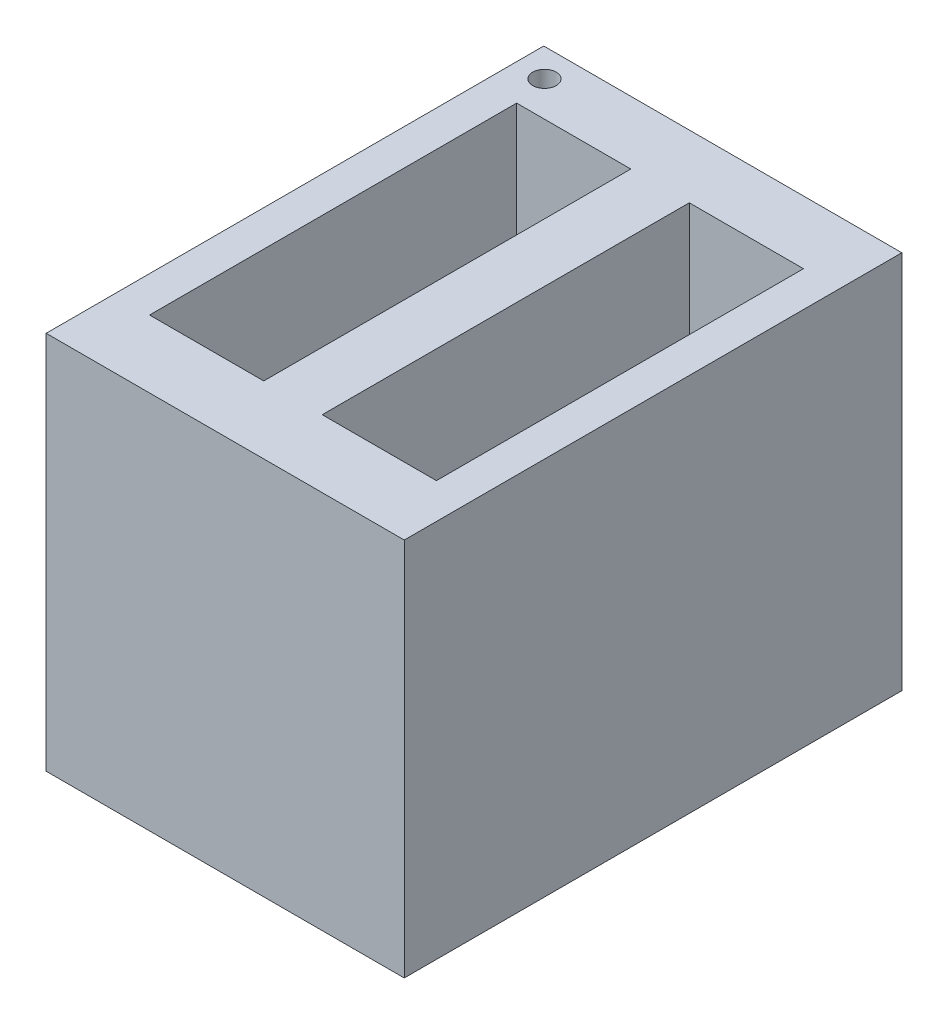
ISO-10303-21;
HEADER;
FILE_DESCRIPTION(('STEP AP214'),'2;1');
FILE_NAME('part.step','',(''),(''),'','','');
FILE_SCHEMA(('AUTOMOTIVE_DESIGN { 1 0 10303 214 1 1 1 1 }'));
ENDSEC;
DATA;
#1=APPLICATION_CONTEXT('core data for automotive mechanical design processes');
#2=APPLICATION_PROTOCOL_DEFINITION('international standard','automotive_design',2000,#1);
#3=PRODUCT_CONTEXT('',#1,'mechanical');
#4=PRODUCT('Part','Part','',(#3));
#5=PRODUCT_RELATED_PRODUCT_CATEGORY('part','',(#4));
#6=PRODUCT_DEFINITION_FORMATION('','',#4);
#7=PRODUCT_DEFINITION_CONTEXT('part definition',#1,'design');
#8=PRODUCT_DEFINITION('design','',#6,#7);
#9=PRODUCT_DEFINITION_SHAPE('','',#8);
#10=(LENGTH_UNIT() NAMED_UNIT(*) SI_UNIT(.MILLI.,.METRE.));
#11=(NAMED_UNIT(*) PLANE_ANGLE_UNIT() SI_UNIT($,.RADIAN.));
#12=(NAMED_UNIT(*) SI_UNIT($,.STERADIAN.) SOLID_ANGLE_UNIT());
#13=UNCERTAINTY_MEASURE_WITH_UNIT(LENGTH_MEASURE(1.E-05),#10,'distance_accuracy_value','');
#14=(GEOMETRIC_REPRESENTATION_CONTEXT(3) GLOBAL_UNCERTAINTY_ASSIGNED_CONTEXT((#13)) GLOBAL_UNIT_ASSIGNED_CONTEXT((#10,
#11,#12)) REPRESENTATION_CONTEXT('',''));
#15=CARTESIAN_POINT('',(0.,0.,0.));
#16=DIRECTION('',(0.,0.,1.));
#17=DIRECTION('',(1.,0.,0.));
#18=AXIS2_PLACEMENT_3D('',#15,#16,#17);
#19=CARTESIAN_POINT('',(0.,4.65,0.));
#20=DIRECTION('',(1.,0.,0.));
#21=DIRECTION('',(0.,0.,-1.));
#22=AXIS2_PLACEMENT_3D('',#19,#20,#21);
#23=PLANE('',#22);
#24=DIRECTION('',(0.,0.,1.));
#25=VECTOR('',#24,1.);
#26=CARTESIAN_POINT('',(0.,0.,0.));
#27=LINE('',#26,#25);
#28=CARTESIAN_POINT('',(0.,0.,-6.1));
#29=VERTEX_POINT('',#28);
#30=CARTESIAN_POINT('',(0.,0.,0.));
#31=VERTEX_POINT('',#30);
#32=EDGE_CURVE('E186',#29,#31,#27,.T.);
#33=ORIENTED_EDGE('',*,*,#32,.T.);
#34=DIRECTION('',(0.,-1.,0.));
#35=VECTOR('',#34,1.);
#36=CARTESIAN_POINT('',(0.,4.65,0.));
#37=LINE('',#36,#35);
#38=CARTESIAN_POINT('',(0.,4.65,0.));
#39=VERTEX_POINT('',#38);
#40=EDGE_CURVE('E11',#39,#31,#37,.T.);
#41=ORIENTED_EDGE('',*,*,#40,.F.);
#42=DIRECTION('',(0.,0.,1.));
#43=VECTOR('',#42,1.);
#44=CARTESIAN_POINT('',(0.,4.65,0.));
#45=LINE('',#44,#43);
#46=CARTESIAN_POINT('',(0.,4.65,-6.1));
#47=VERTEX_POINT('',#46);
#48=EDGE_CURVE('E193',#47,#39,#45,.T.);
#49=ORIENTED_EDGE('',*,*,#48,.F.);
#50=DIRECTION('',(0.,-1.,0.));
#51=VECTOR('',#50,1.);
#52=CARTESIAN_POINT('',(0.,4.65,-6.1));
#53=LINE('',#52,#51);
#54=EDGE_CURVE('E203',#47,#29,#53,.T.);
#55=ORIENTED_EDGE('',*,*,#54,.T.);
#56=EDGE_LOOP('',(#33,#41,#49,#55));
#57=FACE_BOUND('',#56,.T.);
#58=ADVANCED_FACE('F32',(#57),#23,.F.);
#59=CARTESIAN_POINT('',(0.,4.65,0.));
#60=DIRECTION('',(0.,0.,-1.));
#61=DIRECTION('',(-1.,0.,0.));
#62=AXIS2_PLACEMENT_3D('',#59,#60,#61);
#63=PLANE('',#62);
#64=DIRECTION('',(1.,0.,0.));
#65=VECTOR('',#64,1.);
#66=CARTESIAN_POINT('',(0.,0.,0.));
#67=LINE('',#66,#65);
#68=CARTESIAN_POINT('',(4.39,0.,0.));
#69=VERTEX_POINT('',#68);
#70=EDGE_CURVE('E206',#31,#69,#67,.T.);
#71=ORIENTED_EDGE('',*,*,#70,.T.);
#72=DIRECTION('',(0.,-1.,0.));
#73=VECTOR('',#72,1.);
#74=CARTESIAN_POINT('',(4.39,4.65,0.));
#75=LINE('',#74,#73);
#76=CARTESIAN_POINT('',(4.39,4.65,0.));
#77=VERTEX_POINT('',#76);
#78=EDGE_CURVE('E39',#77,#69,#75,.T.);
#79=ORIENTED_EDGE('',*,*,#78,.F.);
#80=DIRECTION('',(1.,0.,0.));
#81=VECTOR('',#80,1.);
#82=CARTESIAN_POINT('',(0.,4.65,0.));
#83=LINE('',#82,#81);
#84=EDGE_CURVE('E196',#39,#77,#83,.T.);
#85=ORIENTED_EDGE('',*,*,#84,.F.);
#86=ORIENTED_EDGE('',*,*,#40,.T.);
#87=EDGE_LOOP('',(#71,#79,#85,#86));
#88=FACE_BOUND('',#87,.T.);
#89=ADVANCED_FACE('F235',(#88),#63,.F.);
#90=CARTESIAN_POINT('',(4.39,4.65,0.));
#91=DIRECTION('',(-1.,0.,0.));
#92=DIRECTION('',(0.,0.,1.));
#93=AXIS2_PLACEMENT_3D('',#90,#91,#92);
#94=PLANE('',#93);
#95=DIRECTION('',(0.,0.,-1.));
#96=VECTOR('',#95,1.);
#97=CARTESIAN_POINT('',(4.39,0.,0.));
#98=LINE('',#97,#96);
#99=CARTESIAN_POINT('',(4.39,0.,-6.1));
#100=VERTEX_POINT('',#99);
#101=EDGE_CURVE('E208',#69,#100,#98,.T.);
#102=ORIENTED_EDGE('',*,*,#101,.T.);
#103=DIRECTION('',(0.,-1.,0.));
#104=VECTOR('',#103,1.);
#105=CARTESIAN_POINT('',(4.39,4.65,-6.1));
#106=LINE('',#105,#104);
#107=CARTESIAN_POINT('',(4.39,4.65,-6.1));
#108=VERTEX_POINT('',#107);
#109=EDGE_CURVE('E213',#108,#100,#106,.T.);
#110=ORIENTED_EDGE('',*,*,#109,.F.);
#111=DIRECTION('',(0.,0.,-1.));
#112=VECTOR('',#111,1.);
#113=CARTESIAN_POINT('',(4.39,4.65,0.));
#114=LINE('',#113,#112);
#115=EDGE_CURVE('E199',#77,#108,#114,.T.);
#116=ORIENTED_EDGE('',*,*,#115,.F.);
#117=ORIENTED_EDGE('',*,*,#78,.T.);
#118=EDGE_LOOP('',(#102,#110,#116,#117));
#119=FACE_BOUND('',#118,.T.);
#120=ADVANCED_FACE('F220',(#119),#94,.F.);
#121=CARTESIAN_POINT('',(0.,4.65,-6.1));
#122=DIRECTION('',(0.,0.,1.));
#123=DIRECTION('',(1.,0.,0.));
#124=AXIS2_PLACEMENT_3D('',#121,#122,#123);
#125=PLANE('',#124);
#126=DIRECTION('',(-1.,0.,0.));
#127=VECTOR('',#126,1.);
#128=CARTESIAN_POINT('',(0.,0.,-6.1));
#129=LINE('',#128,#127);
#130=EDGE_CURVE('E197',#100,#29,#129,.T.);
#131=ORIENTED_EDGE('',*,*,#130,.T.);
#132=ORIENTED_EDGE('',*,*,#54,.F.);
#133=DIRECTION('',(-1.,0.,0.));
#134=VECTOR('',#133,1.);
#135=CARTESIAN_POINT('',(0.,4.65,-6.1));
#136=LINE('',#135,#134);
#137=EDGE_CURVE('E201',#108,#47,#136,.T.);
#138=ORIENTED_EDGE('',*,*,#137,.F.);
#139=ORIENTED_EDGE('',*,*,#109,.T.);
#140=EDGE_LOOP('',(#131,#132,#138,#139));
#141=FACE_BOUND('',#140,.T.);
#142=ADVANCED_FACE('F228',(#141),#125,.F.);
#143=CARTESIAN_POINT('',(0.,4.65,-6.1));
#144=DIRECTION('',(0.,-1.,0.));
#145=DIRECTION('',(0.,0.,-1.));
#146=AXIS2_PLACEMENT_3D('',#143,#144,#145);
#147=PLANE('',#146);
#148=CARTESIAN_POINT('',(0.353367476179774,4.65,-5.75568613944823));
#149=DIRECTION('',(0.,1.,0.));
#150=DIRECTION('',(0.,0.,1.));
#151=AXIS2_PLACEMENT_3D('',#148,#149,#150);
#152=CIRCLE('',#151,0.143820831898844);
#153=CARTESIAN_POINT('',(0.353367476179774,4.65,-5.61186530754938));
#154=VERTEX_POINT('',#153);
#155=EDGE_CURVE('E144',#154,#154,#152,.T.);
#156=ORIENTED_EDGE('',*,*,#155,.F.);
#157=EDGE_LOOP('',(#156));
#158=FACE_BOUND('',#157,.T.);
#159=DIRECTION('',(-1.,0.,0.));
#160=VECTOR('',#159,1.);
#161=CARTESIAN_POINT('',(2.55676455112242,4.65,-5.32761214353261));
#162=LINE('',#161,#160);
#163=CARTESIAN_POINT('',(3.95676455112242,4.65,-5.32761214353261));
#164=VERTEX_POINT('',#163);
#165=CARTESIAN_POINT('',(2.55676455112242,4.65,-5.32761214353261));
#166=VERTEX_POINT('',#165);
#167=EDGE_CURVE('E150',#164,#166,#162,.T.);
#168=ORIENTED_EDGE('',*,*,#167,.F.);
#169=DIRECTION('',(0.,0.,-1.));
#170=VECTOR('',#169,1.);
#171=CARTESIAN_POINT('',(3.95676455112242,4.65,-0.827612143532611));
#172=LINE('',#171,#170);
#173=CARTESIAN_POINT('',(3.95676455112242,4.65,-0.827612143532611));
#174=VERTEX_POINT('',#173);
#175=EDGE_CURVE('E46',#174,#164,#172,.T.);
#176=ORIENTED_EDGE('',*,*,#175,.F.);
#177=DIRECTION('',(1.,0.,0.));
#178=VECTOR('',#177,1.);
#179=CARTESIAN_POINT('',(2.55676455112242,4.65,-0.827612143532611));
#180=LINE('',#179,#178);
#181=CARTESIAN_POINT('',(2.55676455112242,4.65,-0.827612143532611));
#182=VERTEX_POINT('',#181);
#183=EDGE_CURVE('E138',#182,#174,#180,.T.);
#184=ORIENTED_EDGE('',*,*,#183,.F.);
#185=DIRECTION('',(0.,0.,1.));
#186=VECTOR('',#185,1.);
#187=CARTESIAN_POINT('',(2.55676455112242,4.65,-0.827612143532611));
#188=LINE('',#187,#186);
#189=EDGE_CURVE('E141',#166,#182,#188,.T.);
#190=ORIENTED_EDGE('',*,*,#189,.F.);
#191=EDGE_LOOP('',(#168,#176,#184,#190));
#192=FACE_BOUND('',#191,.T.);
#193=DIRECTION('',(1.,0.,0.));
#194=VECTOR('',#193,1.);
#195=CARTESIAN_POINT('',(1.84,4.65,-0.827612143532612));
#196=LINE('',#195,#194);
#197=CARTESIAN_POINT('',(0.44,4.65,-0.827612143532612));
#198=VERTEX_POINT('',#197);
#199=CARTESIAN_POINT('',(1.84,4.65,-0.827612143532612));
#200=VERTEX_POINT('',#199);
#201=EDGE_CURVE('E176',#198,#200,#196,.T.);
#202=ORIENTED_EDGE('',*,*,#201,.F.);
#203=DIRECTION('',(0.,0.,1.));
#204=VECTOR('',#203,1.);
#205=CARTESIAN_POINT('',(0.44,4.65,-0.827612143532612));
#206=LINE('',#205,#204);
#207=CARTESIAN_POINT('',(0.44,4.65,-5.32761214353261));
#208=VERTEX_POINT('',#207);
#209=EDGE_CURVE('E157',#208,#198,#206,.T.);
#210=ORIENTED_EDGE('',*,*,#209,.F.);
#211=DIRECTION('',(-1.,0.,0.));
#212=VECTOR('',#211,1.);
#213=CARTESIAN_POINT('',(1.84,4.65,-5.32761214353261));
#214=LINE('',#213,#212);
#215=CARTESIAN_POINT('',(1.84,4.65,-5.32761214353261));
#216=VERTEX_POINT('',#215);
#217=EDGE_CURVE('E165',#216,#208,#214,.T.);
#218=ORIENTED_EDGE('',*,*,#217,.F.);
#219=DIRECTION('',(0.,0.,-1.));
#220=VECTOR('',#219,1.);
#221=CARTESIAN_POINT('',(1.84,4.65,-0.827612143532612));
#222=LINE('',#221,#220);
#223=EDGE_CURVE('E179',#200,#216,#222,.T.);
#224=ORIENTED_EDGE('',*,*,#223,.F.);
#225=EDGE_LOOP('',(#202,#210,#218,#224));
#226=FACE_BOUND('',#225,.T.);
#227=ORIENTED_EDGE('',*,*,#48,.T.);
#228=ORIENTED_EDGE('',*,*,#84,.T.);
#229=ORIENTED_EDGE('',*,*,#115,.T.);
#230=ORIENTED_EDGE('',*,*,#137,.T.);
#231=EDGE_LOOP('',(#227,#228,#229,#230));
#232=FACE_BOUND('',#231,.T.);
#233=ADVANCED_FACE('F234',(#158,#192,#226,#232),#147,.F.);
#234=CARTESIAN_POINT('',(0.,0.,-6.1));
#235=DIRECTION('',(0.,-1.,0.));
#236=DIRECTION('',(0.,0.,-1.));
#237=AXIS2_PLACEMENT_3D('',#234,#235,#236);
#238=PLANE('',#237);
#239=DIRECTION('',(0.,0.,-1.));
#240=VECTOR('',#239,1.);
#241=CARTESIAN_POINT('',(3.95676455112242,0.,-0.827612143532611));
#242=LINE('',#241,#240);
#243=CARTESIAN_POINT('',(3.95676455112242,0.,-0.827612143532611));
#244=VERTEX_POINT('',#243);
#245=CARTESIAN_POINT('',(3.95676455112242,0.,-5.32761214353261));
#246=VERTEX_POINT('',#245);
#247=EDGE_CURVE('E122',#244,#246,#242,.T.);
#248=ORIENTED_EDGE('',*,*,#247,.T.);
#249=DIRECTION('',(-1.,0.,0.));
#250=VECTOR('',#249,1.);
#251=CARTESIAN_POINT('',(2.55676455112242,0.,-5.32761214353261));
#252=LINE('',#251,#250);
#253=CARTESIAN_POINT('',(2.55676455112242,0.,-5.32761214353261));
#254=VERTEX_POINT('',#253);
#255=EDGE_CURVE('E131',#246,#254,#252,.T.);
#256=ORIENTED_EDGE('',*,*,#255,.T.);
#257=DIRECTION('',(0.,0.,1.));
#258=VECTOR('',#257,1.);
#259=CARTESIAN_POINT('',(2.55676455112242,0.,-0.827612143532611));
#260=LINE('',#259,#258);
#261=CARTESIAN_POINT('',(2.55676455112242,0.,-0.827612143532611));
#262=VERTEX_POINT('',#261);
#263=EDGE_CURVE('E54',#254,#262,#260,.T.);
#264=ORIENTED_EDGE('',*,*,#263,.T.);
#265=DIRECTION('',(1.,0.,0.));
#266=VECTOR('',#265,1.);
#267=CARTESIAN_POINT('',(2.55676455112242,0.,-0.827612143532611));
#268=LINE('',#267,#266);
#269=EDGE_CURVE('E128',#262,#244,#268,.T.);
#270=ORIENTED_EDGE('',*,*,#269,.T.);
#271=EDGE_LOOP('',(#248,#256,#264,#270));
#272=FACE_BOUND('',#271,.T.);
#273=DIRECTION('',(0.,0.,1.));
#274=VECTOR('',#273,1.);
#275=CARTESIAN_POINT('',(0.44,0.,-0.827612143532612));
#276=LINE('',#275,#274);
#277=CARTESIAN_POINT('',(0.44,0.,-5.32761214353261));
#278=VERTEX_POINT('',#277);
#279=CARTESIAN_POINT('',(0.44,0.,-0.827612143532612));
#280=VERTEX_POINT('',#279);
#281=EDGE_CURVE('E161',#278,#280,#276,.T.);
#282=ORIENTED_EDGE('',*,*,#281,.T.);
#283=DIRECTION('',(1.,0.,0.));
#284=VECTOR('',#283,1.);
#285=CARTESIAN_POINT('',(1.84,0.,-0.827612143532612));
#286=LINE('',#285,#284);
#287=CARTESIAN_POINT('',(1.84,0.,-0.827612143532612));
#288=VERTEX_POINT('',#287);
#289=EDGE_CURVE('E164',#280,#288,#286,.T.);
#290=ORIENTED_EDGE('',*,*,#289,.T.);
#291=DIRECTION('',(0.,0.,-1.));
#292=VECTOR('',#291,1.);
#293=CARTESIAN_POINT('',(1.84,0.,-0.827612143532612));
#294=LINE('',#293,#292);
#295=CARTESIAN_POINT('',(1.84,0.,-5.32761214353261));
#296=VERTEX_POINT('',#295);
#297=EDGE_CURVE('E168',#288,#296,#294,.T.);
#298=ORIENTED_EDGE('',*,*,#297,.T.);
#299=DIRECTION('',(-1.,0.,0.));
#300=VECTOR('',#299,1.);
#301=CARTESIAN_POINT('',(1.84,0.,-5.32761214353261));
#302=LINE('',#301,#300);
#303=EDGE_CURVE('E171',#296,#278,#302,.T.);
#304=ORIENTED_EDGE('',*,*,#303,.T.);
#305=EDGE_LOOP('',(#282,#290,#298,#304));
#306=FACE_BOUND('',#305,.T.);
#307=ORIENTED_EDGE('',*,*,#32,.F.);
#308=ORIENTED_EDGE('',*,*,#130,.F.);
#309=ORIENTED_EDGE('',*,*,#101,.F.);
#310=ORIENTED_EDGE('',*,*,#70,.F.);
#311=EDGE_LOOP('',(#307,#308,#309,#310));
#312=FACE_BOUND('',#311,.T.);
#313=ADVANCED_FACE('F135',(#272,#306,#312),#238,.T.);
#314=CARTESIAN_POINT('',(0.44,0.,-0.827612143532612));
#315=DIRECTION('',(-1.,0.,0.));
#316=DIRECTION('',(0.,0.,1.));
#317=AXIS2_PLACEMENT_3D('',#314,#315,#316);
#318=PLANE('',#317);
#319=ORIENTED_EDGE('',*,*,#209,.T.);
#320=DIRECTION('',(0.,1.,0.));
#321=VECTOR('',#320,1.);
#322=CARTESIAN_POINT('',(0.44,0.,-0.827612143532612));
#323=LINE('',#322,#321);
#324=EDGE_CURVE('E174',#280,#198,#323,.T.);
#325=ORIENTED_EDGE('',*,*,#324,.F.);
#326=ORIENTED_EDGE('',*,*,#281,.F.);
#327=DIRECTION('',(0.,1.,0.));
#328=VECTOR('',#327,1.);
#329=CARTESIAN_POINT('',(0.44,0.,-5.32761214353261));
#330=LINE('',#329,#328);
#331=EDGE_CURVE('E184',#278,#208,#330,.T.);
#332=ORIENTED_EDGE('',*,*,#331,.T.);
#333=EDGE_LOOP('',(#319,#325,#326,#332));
#334=FACE_BOUND('',#333,.T.);
#335=ADVANCED_FACE('F247',(#334),#318,.F.);
#336=CARTESIAN_POINT('',(1.84,0.,-5.32761214353261));
#337=DIRECTION('',(0.,0.,-1.));
#338=DIRECTION('',(-1.,0.,0.));
#339=AXIS2_PLACEMENT_3D('',#336,#337,#338);
#340=PLANE('',#339);
#341=ORIENTED_EDGE('',*,*,#217,.T.);
#342=ORIENTED_EDGE('',*,*,#331,.F.);
#343=ORIENTED_EDGE('',*,*,#303,.F.);
#344=DIRECTION('',(0.,1.,0.));
#345=VECTOR('',#344,1.);
#346=CARTESIAN_POINT('',(1.84,0.,-5.32761214353261));
#347=LINE('',#346,#345);
#348=EDGE_CURVE('E187',#296,#216,#347,.T.);
#349=ORIENTED_EDGE('',*,*,#348,.T.);
#350=EDGE_LOOP('',(#341,#342,#343,#349));
#351=FACE_BOUND('',#350,.T.);
#352=ADVANCED_FACE('F253',(#351),#340,.F.);
#353=CARTESIAN_POINT('',(1.84,0.,-0.827612143532612));
#354=DIRECTION('',(1.,0.,0.));
#355=DIRECTION('',(0.,0.,-1.));
#356=AXIS2_PLACEMENT_3D('',#353,#354,#355);
#357=PLANE('',#356);
#358=ORIENTED_EDGE('',*,*,#223,.T.);
#359=ORIENTED_EDGE('',*,*,#348,.F.);
#360=ORIENTED_EDGE('',*,*,#297,.F.);
#361=DIRECTION('',(0.,1.,0.));
#362=VECTOR('',#361,1.);
#363=CARTESIAN_POINT('',(1.84,0.,-0.827612143532612));
#364=LINE('',#363,#362);
#365=EDGE_CURVE('E189',#288,#200,#364,.T.);
#366=ORIENTED_EDGE('',*,*,#365,.T.);
#367=EDGE_LOOP('',(#358,#359,#360,#366));
#368=FACE_BOUND('',#367,.T.);
#369=ADVANCED_FACE('F258',(#368),#357,.F.);
#370=CARTESIAN_POINT('',(1.84,0.,-0.827612143532612));
#371=DIRECTION('',(0.,0.,1.));
#372=DIRECTION('',(1.,0.,0.));
#373=AXIS2_PLACEMENT_3D('',#370,#371,#372);
#374=PLANE('',#373);
#375=ORIENTED_EDGE('',*,*,#201,.T.);
#376=ORIENTED_EDGE('',*,*,#365,.F.);
#377=ORIENTED_EDGE('',*,*,#289,.F.);
#378=ORIENTED_EDGE('',*,*,#324,.T.);
#379=EDGE_LOOP('',(#375,#376,#377,#378));
#380=FACE_BOUND('',#379,.T.);
#381=ADVANCED_FACE('F255',(#380),#374,.F.);
#382=CARTESIAN_POINT('',(3.95676455112242,0.,-0.827612143532611));
#383=DIRECTION('',(1.,0.,0.));
#384=DIRECTION('',(0.,0.,-1.));
#385=AXIS2_PLACEMENT_3D('',#382,#383,#384);
#386=PLANE('',#385);
#387=ORIENTED_EDGE('',*,*,#175,.T.);
#388=DIRECTION('',(0.,1.,0.));
#389=VECTOR('',#388,1.);
#390=CARTESIAN_POINT('',(3.95676455112242,0.,-5.32761214353261));
#391=LINE('',#390,#389);
#392=EDGE_CURVE('E118',#246,#164,#391,.T.);
#393=ORIENTED_EDGE('',*,*,#392,.F.);
#394=ORIENTED_EDGE('',*,*,#247,.F.);
#395=DIRECTION('',(0.,1.,0.));
#396=VECTOR('',#395,1.);
#397=CARTESIAN_POINT('',(3.95676455112242,0.,-0.827612143532611));
#398=LINE('',#397,#396);
#399=EDGE_CURVE('E155',#244,#174,#398,.T.);
#400=ORIENTED_EDGE('',*,*,#399,.T.);
#401=EDGE_LOOP('',(#387,#393,#394,#400));
#402=FACE_BOUND('',#401,.T.);
#403=ADVANCED_FACE('F120',(#402),#386,.F.);
#404=CARTESIAN_POINT('',(2.55676455112242,0.,-0.827612143532611));
#405=DIRECTION('',(0.,0.,1.));
#406=DIRECTION('',(1.,0.,0.));
#407=AXIS2_PLACEMENT_3D('',#404,#405,#406);
#408=PLANE('',#407);
#409=ORIENTED_EDGE('',*,*,#183,.T.);
#410=ORIENTED_EDGE('',*,*,#399,.F.);
#411=ORIENTED_EDGE('',*,*,#269,.F.);
#412=DIRECTION('',(0.,1.,0.));
#413=VECTOR('',#412,1.);
#414=CARTESIAN_POINT('',(2.55676455112242,0.,-0.827612143532611));
#415=LINE('',#414,#413);
#416=EDGE_CURVE('E158',#262,#182,#415,.T.);
#417=ORIENTED_EDGE('',*,*,#416,.T.);
#418=EDGE_LOOP('',(#409,#410,#411,#417));
#419=FACE_BOUND('',#418,.T.);
#420=ADVANCED_FACE('F268',(#419),#408,.F.);
#421=CARTESIAN_POINT('',(2.55676455112242,0.,-0.827612143532611));
#422=DIRECTION('',(-1.,0.,0.));
#423=DIRECTION('',(0.,0.,1.));
#424=AXIS2_PLACEMENT_3D('',#421,#422,#423);
#425=PLANE('',#424);
#426=ORIENTED_EDGE('',*,*,#189,.T.);
#427=ORIENTED_EDGE('',*,*,#416,.F.);
#428=ORIENTED_EDGE('',*,*,#263,.F.);
#429=DIRECTION('',(0.,1.,0.));
#430=VECTOR('',#429,1.);
#431=CARTESIAN_POINT('',(2.55676455112242,0.,-5.32761214353261));
#432=LINE('',#431,#430);
#433=EDGE_CURVE('E127',#254,#166,#432,.T.);
#434=ORIENTED_EDGE('',*,*,#433,.T.);
#435=EDGE_LOOP('',(#426,#427,#428,#434));
#436=FACE_BOUND('',#435,.T.);
#437=ADVANCED_FACE('F272',(#436),#425,.F.);
#438=CARTESIAN_POINT('',(2.55676455112242,0.,-5.32761214353261));
#439=DIRECTION('',(0.,0.,-1.));
#440=DIRECTION('',(-1.,0.,0.));
#441=AXIS2_PLACEMENT_3D('',#438,#439,#440);
#442=PLANE('',#441);
#443=ORIENTED_EDGE('',*,*,#167,.T.);
#444=ORIENTED_EDGE('',*,*,#433,.F.);
#445=ORIENTED_EDGE('',*,*,#255,.F.);
#446=ORIENTED_EDGE('',*,*,#392,.T.);
#447=EDGE_LOOP('',(#443,#444,#445,#446));
#448=FACE_BOUND('',#447,.T.);
#449=ADVANCED_FACE('F132',(#448),#442,.F.);
#450=CARTESIAN_POINT('',(0.353367476179774,4.4,-5.75568613944823));
#451=DIRECTION('',(0.,1.,0.));
#452=DIRECTION('',(0.,0.,1.));
#453=AXIS2_PLACEMENT_3D('',#450,#451,#452);
#454=CYLINDRICAL_SURFACE('',#453,0.143820831898844);
#455=CARTESIAN_POINT('',(0.353367476179774,4.4,-5.75568613944823));
#456=DIRECTION('',(0.,1.,0.));
#457=DIRECTION('',(0.,0.,1.));
#458=AXIS2_PLACEMENT_3D('',#455,#456,#457);
#459=CIRCLE('',#458,0.143820831898844);
#460=CARTESIAN_POINT('',(0.353367476179774,4.4,-5.61186530754938));
#461=VERTEX_POINT('',#460);
#462=EDGE_CURVE('E151',#461,#461,#459,.T.);
#463=ORIENTED_EDGE('',*,*,#462,.F.);
#464=EDGE_LOOP('',(#463));
#465=FACE_BOUND('',#464,.T.);
#466=ORIENTED_EDGE('',*,*,#155,.T.);
#467=EDGE_LOOP('',(#466));
#468=FACE_BOUND('',#467,.T.);
#469=ADVANCED_FACE('F271',(#465,#468),#454,.F.);
#470=CARTESIAN_POINT('',(0.353367476179774,4.4,-5.75568613944823));
#471=DIRECTION('',(0.,1.,0.));
#472=DIRECTION('',(0.,0.,1.));
#473=AXIS2_PLACEMENT_3D('',#470,#471,#472);
#474=PLANE('',#473);
#475=ORIENTED_EDGE('',*,*,#462,.T.);
#476=EDGE_LOOP('',(#475));
#477=FACE_BOUND('',#476,.T.);
#478=ADVANCED_FACE('F280',(#477),#474,.T.);
#479=CLOSED_SHELL('',(#58,#89,#120,#142,#233,#313,#335,#352,#369,#381,#403,#420,#437,#449,#469,#478));
#480=MANIFOLD_SOLID_BREP('B2',#479);
#481=ADVANCED_BREP_SHAPE_REPRESENTATION('',(#18,#480),#14);
#482=SHAPE_DEFINITION_REPRESENTATION(#9,#481);
ENDSEC;
END-ISO-10303-21;
